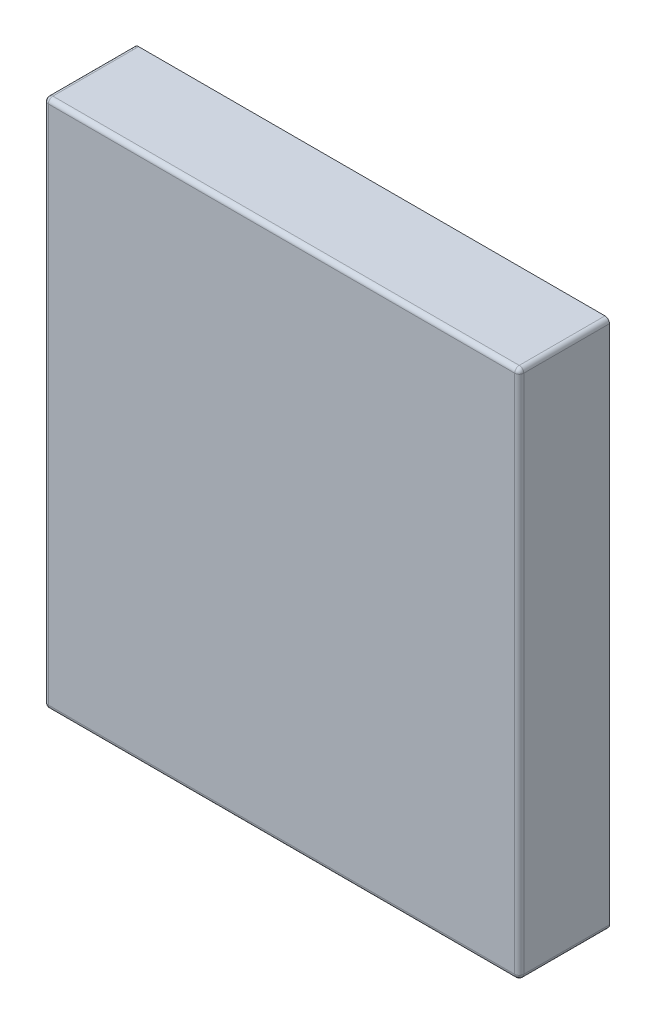
ISO-10303-21;
HEADER;
FILE_DESCRIPTION(('STEP AP214'),'2;1');
FILE_NAME('part.step','',(''),(''),'','','');
FILE_SCHEMA(('AUTOMOTIVE_DESIGN { 1 0 10303 214 1 1 1 1 }'));
ENDSEC;
DATA;
#1=APPLICATION_CONTEXT('core data for automotive mechanical design processes');
#2=APPLICATION_PROTOCOL_DEFINITION('international standard','automotive_design',2000,#1);
#3=PRODUCT_CONTEXT('',#1,'mechanical');
#4=PRODUCT('Part','Part','',(#3));
#5=PRODUCT_RELATED_PRODUCT_CATEGORY('part','',(#4));
#6=PRODUCT_DEFINITION_FORMATION('','',#4);
#7=PRODUCT_DEFINITION_CONTEXT('part definition',#1,'design');
#8=PRODUCT_DEFINITION('design','',#6,#7);
#9=PRODUCT_DEFINITION_SHAPE('','',#8);
#10=(LENGTH_UNIT() NAMED_UNIT(*) SI_UNIT(.MILLI.,.METRE.));
#11=(NAMED_UNIT(*) PLANE_ANGLE_UNIT() SI_UNIT($,.RADIAN.));
#12=(NAMED_UNIT(*) SI_UNIT($,.STERADIAN.) SOLID_ANGLE_UNIT());
#13=UNCERTAINTY_MEASURE_WITH_UNIT(LENGTH_MEASURE(1.E-05),#10,'distance_accuracy_value','');
#14=(GEOMETRIC_REPRESENTATION_CONTEXT(3) GLOBAL_UNCERTAINTY_ASSIGNED_CONTEXT((#13)) GLOBAL_UNIT_ASSIGNED_CONTEXT((#10,
#11,#12)) REPRESENTATION_CONTEXT('',''));
#15=CARTESIAN_POINT('',(0.,0.,0.));
#16=DIRECTION('',(0.,0.,1.));
#17=DIRECTION('',(1.,0.,0.));
#18=AXIS2_PLACEMENT_3D('',#15,#16,#17);
#19=CARTESIAN_POINT('',(-7.9,-8.8,1.5));
#20=DIRECTION('',(1.,0.,0.));
#21=DIRECTION('',(0.,0.,-1.));
#22=AXIS2_PLACEMENT_3D('',#19,#20,#21);
#23=PLANE('',#22);
#24=DIRECTION('',(0.,-1.,0.));
#25=VECTOR('',#24,1.);
#26=CARTESIAN_POINT('',(-7.9,-8.8,-1.5));
#27=LINE('',#26,#25);
#28=CARTESIAN_POINT('',(-7.9,8.65,-1.5));
#29=VERTEX_POINT('',#28);
#30=CARTESIAN_POINT('',(-7.9,-8.65,-1.5));
#31=VERTEX_POINT('',#30);
#32=EDGE_CURVE('E143',#29,#31,#27,.T.);
#33=ORIENTED_EDGE('',*,*,#32,.T.);
#34=DIRECTION('',(0.,0.,-1.));
#35=VECTOR('',#34,1.);
#36=CARTESIAN_POINT('',(-7.9,-8.65,1.5));
#37=LINE('',#36,#35);
#38=CARTESIAN_POINT('',(-7.9,-8.65,1.35));
#39=VERTEX_POINT('',#38);
#40=EDGE_CURVE('E120',#31,#39,#37,.F.);
#41=ORIENTED_EDGE('',*,*,#40,.T.);
#42=DIRECTION('',(0.,-1.,0.));
#43=VECTOR('',#42,1.);
#44=CARTESIAN_POINT('',(-7.9,8.8,1.35));
#45=LINE('',#44,#43);
#46=CARTESIAN_POINT('',(-7.9,8.65,1.35));
#47=VERTEX_POINT('',#46);
#48=EDGE_CURVE('E125',#39,#47,#45,.F.);
#49=ORIENTED_EDGE('',*,*,#48,.T.);
#50=DIRECTION('',(0.,0.,-1.));
#51=VECTOR('',#50,1.);
#52=CARTESIAN_POINT('',(-7.9,8.65,1.5));
#53=LINE('',#52,#51);
#54=EDGE_CURVE('E159',#47,#29,#53,.T.);
#55=ORIENTED_EDGE('',*,*,#54,.T.);
#56=EDGE_LOOP('',(#33,#41,#49,#55));
#57=FACE_BOUND('',#56,.T.);
#58=ADVANCED_FACE('F39',(#57),#23,.F.);
#59=CARTESIAN_POINT('',(7.9,-8.8,1.5));
#60=DIRECTION('',(0.,1.,0.));
#61=DIRECTION('',(-1.,0.,0.));
#62=AXIS2_PLACEMENT_3D('',#59,#60,#61);
#63=PLANE('',#62);
#64=DIRECTION('',(1.,0.,0.));
#65=VECTOR('',#64,1.);
#66=CARTESIAN_POINT('',(-7.9,-8.8,1.35));
#67=LINE('',#66,#65);
#68=CARTESIAN_POINT('',(7.75,-8.8,1.35));
#69=VERTEX_POINT('',#68);
#70=CARTESIAN_POINT('',(-7.75,-8.8,1.35));
#71=VERTEX_POINT('',#70);
#72=EDGE_CURVE('E134',#69,#71,#67,.F.);
#73=ORIENTED_EDGE('',*,*,#72,.T.);
#74=DIRECTION('',(0.,0.,-1.));
#75=VECTOR('',#74,1.);
#76=CARTESIAN_POINT('',(-7.75,-8.8,1.5));
#77=LINE('',#76,#75);
#78=CARTESIAN_POINT('',(-7.75,-8.8,-1.5));
#79=VERTEX_POINT('',#78);
#80=EDGE_CURVE('E119',#71,#79,#77,.T.);
#81=ORIENTED_EDGE('',*,*,#80,.T.);
#82=DIRECTION('',(1.,0.,0.));
#83=VECTOR('',#82,1.);
#84=CARTESIAN_POINT('',(7.9,-8.8,-1.5));
#85=LINE('',#84,#83);
#86=CARTESIAN_POINT('',(7.75,-8.8,-1.5));
#87=VERTEX_POINT('',#86);
#88=EDGE_CURVE('E131',#79,#87,#85,.T.);
#89=ORIENTED_EDGE('',*,*,#88,.T.);
#90=DIRECTION('',(0.,0.,-1.));
#91=VECTOR('',#90,1.);
#92=CARTESIAN_POINT('',(7.75,-8.8,1.5));
#93=LINE('',#92,#91);
#94=EDGE_CURVE('E137',#87,#69,#93,.F.);
#95=ORIENTED_EDGE('',*,*,#94,.T.);
#96=EDGE_LOOP('',(#73,#81,#89,#95));
#97=FACE_BOUND('',#96,.T.);
#98=ADVANCED_FACE('F130',(#97),#63,.F.);
#99=CARTESIAN_POINT('',(7.9,-8.8,1.5));
#100=DIRECTION('',(-1.,0.,0.));
#101=DIRECTION('',(0.,0.,1.));
#102=AXIS2_PLACEMENT_3D('',#99,#100,#101);
#103=PLANE('',#102);
#104=DIRECTION('',(0.,1.,0.));
#105=VECTOR('',#104,1.);
#106=CARTESIAN_POINT('',(7.9,-8.8,1.35));
#107=LINE('',#106,#105);
#108=CARTESIAN_POINT('',(7.9,8.65,1.35));
#109=VERTEX_POINT('',#108);
#110=CARTESIAN_POINT('',(7.9,-8.65,1.35));
#111=VERTEX_POINT('',#110);
#112=EDGE_CURVE('E162',#109,#111,#107,.F.);
#113=ORIENTED_EDGE('',*,*,#112,.T.);
#114=DIRECTION('',(0.,0.,-1.));
#115=VECTOR('',#114,1.);
#116=CARTESIAN_POINT('',(7.9,-8.65,1.5));
#117=LINE('',#116,#115);
#118=CARTESIAN_POINT('',(7.9,-8.65,-1.5));
#119=VERTEX_POINT('',#118);
#120=EDGE_CURVE('E166',#111,#119,#117,.T.);
#121=ORIENTED_EDGE('',*,*,#120,.T.);
#122=DIRECTION('',(0.,1.,0.));
#123=VECTOR('',#122,1.);
#124=CARTESIAN_POINT('',(7.9,-8.8,-1.5));
#125=LINE('',#124,#123);
#126=CARTESIAN_POINT('',(7.9,8.65,-1.5));
#127=VERTEX_POINT('',#126);
#128=EDGE_CURVE('E142',#119,#127,#125,.T.);
#129=ORIENTED_EDGE('',*,*,#128,.T.);
#130=DIRECTION('',(0.,0.,-1.));
#131=VECTOR('',#130,1.);
#132=CARTESIAN_POINT('',(7.9,8.65,1.5));
#133=LINE('',#132,#131);
#134=EDGE_CURVE('E164',#127,#109,#133,.F.);
#135=ORIENTED_EDGE('',*,*,#134,.T.);
#136=EDGE_LOOP('',(#113,#121,#129,#135));
#137=FACE_BOUND('',#136,.T.);
#138=ADVANCED_FACE('F259',(#137),#103,.F.);
#139=CARTESIAN_POINT('',(7.9,8.8,1.5));
#140=DIRECTION('',(0.,-1.,0.));
#141=DIRECTION('',(1.,0.,0.));
#142=AXIS2_PLACEMENT_3D('',#139,#140,#141);
#143=PLANE('',#142);
#144=DIRECTION('',(-1.,0.,0.));
#145=VECTOR('',#144,1.);
#146=CARTESIAN_POINT('',(7.9,8.8,1.35));
#147=LINE('',#146,#145);
#148=CARTESIAN_POINT('',(-7.75,8.8,1.35));
#149=VERTEX_POINT('',#148);
#150=CARTESIAN_POINT('',(7.75,8.8,1.35));
#151=VERTEX_POINT('',#150);
#152=EDGE_CURVE('E168',#149,#151,#147,.F.);
#153=ORIENTED_EDGE('',*,*,#152,.T.);
#154=DIRECTION('',(0.,0.,-1.));
#155=VECTOR('',#154,1.);
#156=CARTESIAN_POINT('',(7.75,8.8,1.5));
#157=LINE('',#156,#155);
#158=CARTESIAN_POINT('',(7.75,8.8,-1.5));
#159=VERTEX_POINT('',#158);
#160=EDGE_CURVE('E172',#151,#159,#157,.T.);
#161=ORIENTED_EDGE('',*,*,#160,.T.);
#162=DIRECTION('',(-1.,0.,0.));
#163=VECTOR('',#162,1.);
#164=CARTESIAN_POINT('',(7.9,8.8,-1.5));
#165=LINE('',#164,#163);
#166=CARTESIAN_POINT('',(-7.75,8.8,-1.5));
#167=VERTEX_POINT('',#166);
#168=EDGE_CURVE('E146',#159,#167,#165,.T.);
#169=ORIENTED_EDGE('',*,*,#168,.T.);
#170=DIRECTION('',(0.,0.,-1.));
#171=VECTOR('',#170,1.);
#172=CARTESIAN_POINT('',(-7.75,8.8,1.5));
#173=LINE('',#172,#171);
#174=EDGE_CURVE('E170',#167,#149,#173,.F.);
#175=ORIENTED_EDGE('',*,*,#174,.T.);
#176=EDGE_LOOP('',(#153,#161,#169,#175));
#177=FACE_BOUND('',#176,.T.);
#178=ADVANCED_FACE('F223',(#177),#143,.F.);
#179=CARTESIAN_POINT('',(0.,0.,1.5));
#180=DIRECTION('',(0.,0.,1.));
#181=DIRECTION('',(1.,0.,0.));
#182=AXIS2_PLACEMENT_3D('',#179,#180,#181);
#183=PLANE('',#182);
#184=DIRECTION('',(1.,0.,0.));
#185=VECTOR('',#184,1.);
#186=CARTESIAN_POINT('',(7.9,-8.65,1.5));
#187=LINE('',#186,#185);
#188=CARTESIAN_POINT('',(-7.75,-8.65,1.5));
#189=VERTEX_POINT('',#188);
#190=CARTESIAN_POINT('',(7.75,-8.65,1.5));
#191=VERTEX_POINT('',#190);
#192=EDGE_CURVE('E48',#189,#191,#187,.T.);
#193=ORIENTED_EDGE('',*,*,#192,.T.);
#194=DIRECTION('',(0.,1.,0.));
#195=VECTOR('',#194,1.);
#196=CARTESIAN_POINT('',(7.75,8.8,1.5));
#197=LINE('',#196,#195);
#198=CARTESIAN_POINT('',(7.75,8.65,1.5));
#199=VERTEX_POINT('',#198);
#200=EDGE_CURVE('E11',#191,#199,#197,.T.);
#201=ORIENTED_EDGE('',*,*,#200,.T.);
#202=DIRECTION('',(-1.,0.,0.));
#203=VECTOR('',#202,1.);
#204=CARTESIAN_POINT('',(-7.9,8.65,1.5));
#205=LINE('',#204,#203);
#206=CARTESIAN_POINT('',(-7.75,8.65,1.5));
#207=VERTEX_POINT('',#206);
#208=EDGE_CURVE('E174',#199,#207,#205,.T.);
#209=ORIENTED_EDGE('',*,*,#208,.T.);
#210=DIRECTION('',(0.,-1.,0.));
#211=VECTOR('',#210,1.);
#212=CARTESIAN_POINT('',(-7.75,-8.8,1.5));
#213=LINE('',#212,#211);
#214=EDGE_CURVE('E59',#207,#189,#213,.T.);
#215=ORIENTED_EDGE('',*,*,#214,.T.);
#216=EDGE_LOOP('',(#193,#201,#209,#215));
#217=FACE_BOUND('',#216,.T.);
#218=ADVANCED_FACE('F251',(#217),#183,.T.);
#219=CARTESIAN_POINT('',(0.,0.,-1.5));
#220=DIRECTION('',(0.,0.,1.));
#221=DIRECTION('',(1.,0.,0.));
#222=AXIS2_PLACEMENT_3D('',#219,#220,#221);
#223=PLANE('',#222);
#224=ORIENTED_EDGE('',*,*,#88,.F.);
#225=CARTESIAN_POINT('',(-7.75,-8.65,-1.5));
#226=DIRECTION('',(0.,0.,1.));
#227=DIRECTION('',(1.,0.,0.));
#228=AXIS2_PLACEMENT_3D('',#225,#226,#227);
#229=CIRCLE('',#228,0.15);
#230=EDGE_CURVE('E115',#79,#31,#229,.F.);
#231=ORIENTED_EDGE('',*,*,#230,.T.);
#232=ORIENTED_EDGE('',*,*,#32,.F.);
#233=CARTESIAN_POINT('',(-7.75,8.65,-1.5));
#234=DIRECTION('',(0.,0.,1.));
#235=DIRECTION('',(1.,0.,0.));
#236=AXIS2_PLACEMENT_3D('',#233,#234,#235);
#237=CIRCLE('',#236,0.15);
#238=EDGE_CURVE('E136',#29,#167,#237,.F.);
#239=ORIENTED_EDGE('',*,*,#238,.T.);
#240=ORIENTED_EDGE('',*,*,#168,.F.);
#241=CARTESIAN_POINT('',(7.75,8.65,-1.5));
#242=DIRECTION('',(0.,0.,1.));
#243=DIRECTION('',(1.,0.,0.));
#244=AXIS2_PLACEMENT_3D('',#241,#242,#243);
#245=CIRCLE('',#244,0.15);
#246=EDGE_CURVE('E155',#159,#127,#245,.F.);
#247=ORIENTED_EDGE('',*,*,#246,.T.);
#248=ORIENTED_EDGE('',*,*,#128,.F.);
#249=CARTESIAN_POINT('',(7.75,-8.65,-1.5));
#250=DIRECTION('',(0.,0.,1.));
#251=DIRECTION('',(1.,0.,0.));
#252=AXIS2_PLACEMENT_3D('',#249,#250,#251);
#253=CIRCLE('',#252,0.15);
#254=EDGE_CURVE('E126',#119,#87,#253,.F.);
#255=ORIENTED_EDGE('',*,*,#254,.T.);
#256=EDGE_LOOP('',(#224,#231,#232,#239,#240,#247,#248,#255));
#257=FACE_BOUND('',#256,.T.);
#258=ADVANCED_FACE('F139',(#257),#223,.F.);
#259=CARTESIAN_POINT('',(7.75,8.65,1.5));
#260=DIRECTION('',(0.,0.,-1.));
#261=DIRECTION('',(-1.,0.,0.));
#262=AXIS2_PLACEMENT_3D('',#259,#260,#261);
#263=CYLINDRICAL_SURFACE('',#262,0.15);
#264=CARTESIAN_POINT('',(7.75,8.65,1.35));
#265=DIRECTION('',(0.,0.,1.));
#266=DIRECTION('',(1.,0.,0.));
#267=AXIS2_PLACEMENT_3D('',#264,#265,#266);
#268=CIRCLE('',#267,0.15);
#269=EDGE_CURVE('E43',#109,#151,#268,.T.);
#270=ORIENTED_EDGE('',*,*,#269,.F.);
#271=ORIENTED_EDGE('',*,*,#134,.F.);
#272=ORIENTED_EDGE('',*,*,#246,.F.);
#273=ORIENTED_EDGE('',*,*,#160,.F.);
#274=EDGE_LOOP('',(#270,#271,#272,#273));
#275=FACE_BOUND('',#274,.T.);
#276=ADVANCED_FACE('F41',(#275),#263,.T.);
#277=CARTESIAN_POINT('',(7.75,8.65,1.35));
#278=DIRECTION('',(0.,1.,0.));
#279=DIRECTION('',(0.,0.,1.));
#280=AXIS2_PLACEMENT_3D('',#277,#278,#279);
#281=SPHERICAL_SURFACE('',#280,0.15);
#282=CARTESIAN_POINT('',(7.75,8.65,1.35));
#283=DIRECTION('',(0.,1.,0.));
#284=DIRECTION('',(0.,0.,1.));
#285=AXIS2_PLACEMENT_3D('',#282,#283,#284);
#286=CIRCLE('',#285,0.15);
#287=EDGE_CURVE('E204',#109,#199,#286,.F.);
#288=ORIENTED_EDGE('',*,*,#287,.F.);
#289=ORIENTED_EDGE('',*,*,#269,.T.);
#290=CARTESIAN_POINT('',(7.75,8.65,1.35));
#291=DIRECTION('',(1.,0.,0.));
#292=DIRECTION('',(0.,0.,-1.));
#293=AXIS2_PLACEMENT_3D('',#290,#291,#292);
#294=CIRCLE('',#293,0.15);
#295=EDGE_CURVE('E206',#199,#151,#294,.F.);
#296=ORIENTED_EDGE('',*,*,#295,.F.);
#297=EDGE_LOOP('',(#288,#289,#296));
#298=FACE_BOUND('',#297,.T.);
#299=ADVANCED_FACE('F215',(#298),#281,.T.);
#300=CARTESIAN_POINT('',(-7.75,8.65,1.5));
#301=DIRECTION('',(0.,0.,-1.));
#302=DIRECTION('',(-1.,0.,0.));
#303=AXIS2_PLACEMENT_3D('',#300,#301,#302);
#304=CYLINDRICAL_SURFACE('',#303,0.15);
#305=ORIENTED_EDGE('',*,*,#238,.F.);
#306=ORIENTED_EDGE('',*,*,#54,.F.);
#307=CARTESIAN_POINT('',(-7.75,8.65,1.35));
#308=DIRECTION('',(0.,0.,1.));
#309=DIRECTION('',(1.,0.,0.));
#310=AXIS2_PLACEMENT_3D('',#307,#308,#309);
#311=CIRCLE('',#310,0.15);
#312=EDGE_CURVE('E201',#149,#47,#311,.T.);
#313=ORIENTED_EDGE('',*,*,#312,.F.);
#314=ORIENTED_EDGE('',*,*,#174,.F.);
#315=EDGE_LOOP('',(#305,#306,#313,#314));
#316=FACE_BOUND('',#315,.T.);
#317=ADVANCED_FACE('F228',(#316),#304,.T.);
#318=CARTESIAN_POINT('',(0.,8.65,1.35));
#319=DIRECTION('',(1.,0.,0.));
#320=DIRECTION('',(0.,1.,0.));
#321=AXIS2_PLACEMENT_3D('',#318,#319,#320);
#322=CYLINDRICAL_SURFACE('',#321,0.15);
#323=ORIENTED_EDGE('',*,*,#295,.T.);
#324=ORIENTED_EDGE('',*,*,#152,.F.);
#325=CARTESIAN_POINT('',(-7.75,8.65,1.35));
#326=DIRECTION('',(-1.,0.,0.));
#327=DIRECTION('',(0.,0.,1.));
#328=AXIS2_PLACEMENT_3D('',#325,#326,#327);
#329=CIRCLE('',#328,0.15);
#330=EDGE_CURVE('E198',#207,#149,#329,.T.);
#331=ORIENTED_EDGE('',*,*,#330,.F.);
#332=ORIENTED_EDGE('',*,*,#208,.F.);
#333=EDGE_LOOP('',(#323,#324,#331,#332));
#334=FACE_BOUND('',#333,.T.);
#335=ADVANCED_FACE('F231',(#334),#322,.T.);
#336=CARTESIAN_POINT('',(7.75,0.,1.35));
#337=DIRECTION('',(0.,-1.,0.));
#338=DIRECTION('',(0.,0.,-1.));
#339=AXIS2_PLACEMENT_3D('',#336,#337,#338);
#340=CYLINDRICAL_SURFACE('',#339,0.15);
#341=ORIENTED_EDGE('',*,*,#287,.T.);
#342=ORIENTED_EDGE('',*,*,#200,.F.);
#343=CARTESIAN_POINT('',(7.75,-8.65,1.35));
#344=DIRECTION('',(0.,-1.,0.));
#345=DIRECTION('',(0.,0.,-1.));
#346=AXIS2_PLACEMENT_3D('',#343,#344,#345);
#347=CIRCLE('',#346,0.15);
#348=EDGE_CURVE('E195',#111,#191,#347,.T.);
#349=ORIENTED_EDGE('',*,*,#348,.F.);
#350=ORIENTED_EDGE('',*,*,#112,.F.);
#351=EDGE_LOOP('',(#341,#342,#349,#350));
#352=FACE_BOUND('',#351,.T.);
#353=ADVANCED_FACE('F250',(#352),#340,.T.);
#354=CARTESIAN_POINT('',(7.75,-8.65,1.5));
#355=DIRECTION('',(0.,0.,-1.));
#356=DIRECTION('',(-1.,0.,0.));
#357=AXIS2_PLACEMENT_3D('',#354,#355,#356);
#358=CYLINDRICAL_SURFACE('',#357,0.15);
#359=ORIENTED_EDGE('',*,*,#254,.F.);
#360=ORIENTED_EDGE('',*,*,#120,.F.);
#361=CARTESIAN_POINT('',(7.75,-8.65,1.35));
#362=DIRECTION('',(0.,0.,1.));
#363=DIRECTION('',(1.,0.,0.));
#364=AXIS2_PLACEMENT_3D('',#361,#362,#363);
#365=CIRCLE('',#364,0.15);
#366=EDGE_CURVE('E192',#69,#111,#365,.T.);
#367=ORIENTED_EDGE('',*,*,#366,.F.);
#368=ORIENTED_EDGE('',*,*,#94,.F.);
#369=EDGE_LOOP('',(#359,#360,#367,#368));
#370=FACE_BOUND('',#369,.T.);
#371=ADVANCED_FACE('F282',(#370),#358,.T.);
#372=CARTESIAN_POINT('',(-7.75,8.65,1.35));
#373=DIRECTION('',(0.,1.,0.));
#374=DIRECTION('',(0.,0.,1.));
#375=AXIS2_PLACEMENT_3D('',#372,#373,#374);
#376=SPHERICAL_SURFACE('',#375,0.15);
#377=ORIENTED_EDGE('',*,*,#330,.T.);
#378=ORIENTED_EDGE('',*,*,#312,.T.);
#379=CARTESIAN_POINT('',(-7.75,8.65,1.35));
#380=DIRECTION('',(0.,1.,0.));
#381=DIRECTION('',(0.,0.,1.));
#382=AXIS2_PLACEMENT_3D('',#379,#380,#381);
#383=CIRCLE('',#382,0.15);
#384=EDGE_CURVE('E189',#207,#47,#383,.F.);
#385=ORIENTED_EDGE('',*,*,#384,.F.);
#386=EDGE_LOOP('',(#377,#378,#385));
#387=FACE_BOUND('',#386,.T.);
#388=ADVANCED_FACE('F234',(#387),#376,.T.);
#389=CARTESIAN_POINT('',(7.75,-8.65,1.35));
#390=DIRECTION('',(1.,0.,0.));
#391=DIRECTION('',(0.,0.,-1.));
#392=AXIS2_PLACEMENT_3D('',#389,#390,#391);
#393=SPHERICAL_SURFACE('',#392,0.15);
#394=ORIENTED_EDGE('',*,*,#366,.T.);
#395=ORIENTED_EDGE('',*,*,#348,.T.);
#396=CARTESIAN_POINT('',(7.75,-8.65,1.35));
#397=DIRECTION('',(1.,0.,0.));
#398=DIRECTION('',(0.,0.,-1.));
#399=AXIS2_PLACEMENT_3D('',#396,#397,#398);
#400=CIRCLE('',#399,0.15);
#401=EDGE_CURVE('E186',#69,#191,#400,.F.);
#402=ORIENTED_EDGE('',*,*,#401,.F.);
#403=EDGE_LOOP('',(#394,#395,#402));
#404=FACE_BOUND('',#403,.T.);
#405=ADVANCED_FACE('F246',(#404),#393,.T.);
#406=CARTESIAN_POINT('',(-7.75,0.,1.35));
#407=DIRECTION('',(0.,1.,0.));
#408=DIRECTION('',(0.,0.,1.));
#409=AXIS2_PLACEMENT_3D('',#406,#407,#408);
#410=CYLINDRICAL_SURFACE('',#409,0.15);
#411=ORIENTED_EDGE('',*,*,#384,.T.);
#412=ORIENTED_EDGE('',*,*,#48,.F.);
#413=CARTESIAN_POINT('',(-7.75,-8.65,1.35));
#414=DIRECTION('',(0.,-1.,0.));
#415=DIRECTION('',(0.,0.,-1.));
#416=AXIS2_PLACEMENT_3D('',#413,#414,#415);
#417=CIRCLE('',#416,0.15);
#418=EDGE_CURVE('E183',#189,#39,#417,.T.);
#419=ORIENTED_EDGE('',*,*,#418,.F.);
#420=ORIENTED_EDGE('',*,*,#214,.F.);
#421=EDGE_LOOP('',(#411,#412,#419,#420));
#422=FACE_BOUND('',#421,.T.);
#423=ADVANCED_FACE('F238',(#422),#410,.T.);
#424=CARTESIAN_POINT('',(0.,-8.65,1.35));
#425=DIRECTION('',(-1.,0.,0.));
#426=DIRECTION('',(0.,-1.,0.));
#427=AXIS2_PLACEMENT_3D('',#424,#425,#426);
#428=CYLINDRICAL_SURFACE('',#427,0.15);
#429=ORIENTED_EDGE('',*,*,#401,.T.);
#430=ORIENTED_EDGE('',*,*,#192,.F.);
#431=CARTESIAN_POINT('',(-7.75,-8.65,1.35));
#432=DIRECTION('',(-1.,0.,0.));
#433=DIRECTION('',(0.,0.,1.));
#434=AXIS2_PLACEMENT_3D('',#431,#432,#433);
#435=CIRCLE('',#434,0.15);
#436=EDGE_CURVE('E180',#71,#189,#435,.T.);
#437=ORIENTED_EDGE('',*,*,#436,.F.);
#438=ORIENTED_EDGE('',*,*,#72,.F.);
#439=EDGE_LOOP('',(#429,#430,#437,#438));
#440=FACE_BOUND('',#439,.T.);
#441=ADVANCED_FACE('F243',(#440),#428,.T.);
#442=CARTESIAN_POINT('',(-7.75,-8.65,1.35));
#443=DIRECTION('',(0.,0.,1.));
#444=DIRECTION('',(1.,0.,0.));
#445=AXIS2_PLACEMENT_3D('',#442,#443,#444);
#446=SPHERICAL_SURFACE('',#445,0.15);
#447=ORIENTED_EDGE('',*,*,#436,.T.);
#448=ORIENTED_EDGE('',*,*,#418,.T.);
#449=CARTESIAN_POINT('',(-7.75,-8.65,1.35));
#450=DIRECTION('',(0.,0.,1.));
#451=DIRECTION('',(1.,0.,0.));
#452=AXIS2_PLACEMENT_3D('',#449,#450,#451);
#453=CIRCLE('',#452,0.15);
#454=EDGE_CURVE('E178',#71,#39,#453,.F.);
#455=ORIENTED_EDGE('',*,*,#454,.F.);
#456=EDGE_LOOP('',(#447,#448,#455));
#457=FACE_BOUND('',#456,.T.);
#458=ADVANCED_FACE('F241',(#457),#446,.T.);
#459=CARTESIAN_POINT('',(-7.75,-8.65,1.5));
#460=DIRECTION('',(0.,0.,-1.));
#461=DIRECTION('',(-1.,0.,0.));
#462=AXIS2_PLACEMENT_3D('',#459,#460,#461);
#463=CYLINDRICAL_SURFACE('',#462,0.15);
#464=ORIENTED_EDGE('',*,*,#454,.T.);
#465=ORIENTED_EDGE('',*,*,#40,.F.);
#466=ORIENTED_EDGE('',*,*,#230,.F.);
#467=ORIENTED_EDGE('',*,*,#80,.F.);
#468=EDGE_LOOP('',(#464,#465,#466,#467));
#469=FACE_BOUND('',#468,.T.);
#470=ADVANCED_FACE('F118',(#469),#463,.T.);
#471=CLOSED_SHELL('',(#58,#98,#138,#178,#218,#258,#276,#299,#317,#335,#353,#371,#388,#405,#423,
#441,#458,#470));
#472=MANIFOLD_SOLID_BREP('B2',#471);
#473=ADVANCED_BREP_SHAPE_REPRESENTATION('',(#18,#472),#14);
#474=SHAPE_DEFINITION_REPRESENTATION(#9,#473);
ENDSEC;
END-ISO-10303-21;
